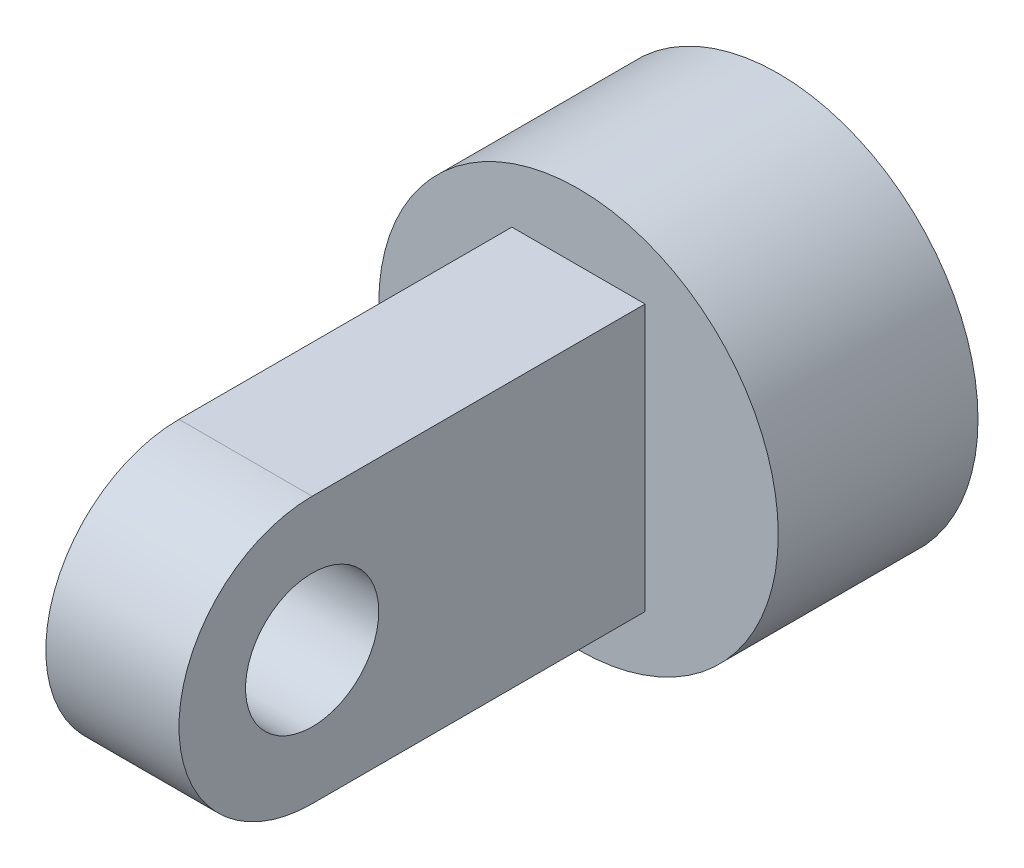
ISO-10303-21;
HEADER;
FILE_DESCRIPTION(('STEP AP214'),'2;1');
FILE_NAME('part.step','',(''),(''),'','','');
FILE_SCHEMA(('AUTOMOTIVE_DESIGN { 1 0 10303 214 1 1 1 1 }'));
ENDSEC;
DATA;
#1=APPLICATION_CONTEXT('core data for automotive mechanical design processes');
#2=APPLICATION_PROTOCOL_DEFINITION('international standard','automotive_design',2000,#1);
#3=PRODUCT_CONTEXT('',#1,'mechanical');
#4=PRODUCT('Part','Part','',(#3));
#5=PRODUCT_RELATED_PRODUCT_CATEGORY('part','',(#4));
#6=PRODUCT_DEFINITION_FORMATION('','',#4);
#7=PRODUCT_DEFINITION_CONTEXT('part definition',#1,'design');
#8=PRODUCT_DEFINITION('design','',#6,#7);
#9=PRODUCT_DEFINITION_SHAPE('','',#8);
#10=(LENGTH_UNIT() NAMED_UNIT(*) SI_UNIT(.MILLI.,.METRE.));
#11=(NAMED_UNIT(*) PLANE_ANGLE_UNIT() SI_UNIT($,.RADIAN.));
#12=(NAMED_UNIT(*) SI_UNIT($,.STERADIAN.) SOLID_ANGLE_UNIT());
#13=UNCERTAINTY_MEASURE_WITH_UNIT(LENGTH_MEASURE(1.E-05),#10,'distance_accuracy_value','');
#14=(GEOMETRIC_REPRESENTATION_CONTEXT(3) GLOBAL_UNCERTAINTY_ASSIGNED_CONTEXT((#13)) GLOBAL_UNIT_ASSIGNED_CONTEXT((#10,
#11,#12)) REPRESENTATION_CONTEXT('',''));
#15=CARTESIAN_POINT('',(0.,0.,0.));
#16=DIRECTION('',(0.,0.,1.));
#17=DIRECTION('',(1.,0.,0.));
#18=AXIS2_PLACEMENT_3D('',#15,#16,#17);
#19=CARTESIAN_POINT('',(12.7,0.,0.));
#20=DIRECTION('',(1.,0.,0.));
#21=DIRECTION('',(0.,0.,-1.));
#22=AXIS2_PLACEMENT_3D('',#19,#20,#21);
#23=PLANE('',#22);
#24=CARTESIAN_POINT('',(12.7,0.,0.));
#25=DIRECTION('',(1.,0.,0.));
#26=DIRECTION('',(0.,0.,-1.));
#27=AXIS2_PLACEMENT_3D('',#24,#25,#26);
#28=CIRCLE('',#27,12.7);
#29=CARTESIAN_POINT('',(12.7,12.7,0.));
#30=VERTEX_POINT('',#29);
#31=CARTESIAN_POINT('',(12.7,-12.7,0.));
#32=VERTEX_POINT('',#31);
#33=EDGE_CURVE('E12',#30,#32,#28,.T.);
#34=ORIENTED_EDGE('',*,*,#33,.T.);
#35=DIRECTION('',(0.,0.,-1.));
#36=VECTOR('',#35,1.);
#37=CARTESIAN_POINT('',(12.7,-12.7,-31.75));
#38=LINE('',#37,#36);
#39=CARTESIAN_POINT('',(12.7,-12.7,-31.75));
#40=VERTEX_POINT('',#39);
#41=EDGE_CURVE('E190',#32,#40,#38,.T.);
#42=ORIENTED_EDGE('',*,*,#41,.T.);
#43=DIRECTION('',(0.,1.,0.));
#44=VECTOR('',#43,1.);
#45=CARTESIAN_POINT('',(12.7,12.7,-31.75));
#46=LINE('',#45,#44);
#47=CARTESIAN_POINT('',(12.7,12.7,-31.75));
#48=VERTEX_POINT('',#47);
#49=EDGE_CURVE('E96',#40,#48,#46,.T.);
#50=ORIENTED_EDGE('',*,*,#49,.T.);
#51=DIRECTION('',(0.,0.,1.));
#52=VECTOR('',#51,1.);
#53=CARTESIAN_POINT('',(12.7,12.7,0.));
#54=LINE('',#53,#52);
#55=EDGE_CURVE('E191',#48,#30,#54,.T.);
#56=ORIENTED_EDGE('',*,*,#55,.T.);
#57=EDGE_LOOP('',(#34,#42,#50,#56));
#58=FACE_BOUND('',#57,.T.);
#59=CARTESIAN_POINT('',(12.7,0.,0.));
#60=DIRECTION('',(1.,0.,0.));
#61=DIRECTION('',(0.,0.,-1.));
#62=AXIS2_PLACEMENT_3D('',#59,#60,#61);
#63=CIRCLE('',#62,6.35);
#64=CARTESIAN_POINT('',(12.7,0.,-6.35));
#65=VERTEX_POINT('',#64);
#66=EDGE_CURVE('E125',#65,#65,#63,.T.);
#67=ORIENTED_EDGE('',*,*,#66,.F.);
#68=EDGE_LOOP('',(#67));
#69=FACE_BOUND('',#68,.T.);
#70=ADVANCED_FACE('F51',(#58,#69),#23,.T.);
#71=CARTESIAN_POINT('',(0.,0.,0.));
#72=DIRECTION('',(1.,0.,0.));
#73=DIRECTION('',(0.,0.,-1.));
#74=AXIS2_PLACEMENT_3D('',#71,#72,#73);
#75=PLANE('',#74);
#76=CARTESIAN_POINT('',(0.,0.,0.));
#77=DIRECTION('',(1.,0.,0.));
#78=DIRECTION('',(0.,0.,-1.));
#79=AXIS2_PLACEMENT_3D('',#76,#77,#78);
#80=CIRCLE('',#79,12.7);
#81=CARTESIAN_POINT('',(0.,12.7,0.));
#82=VERTEX_POINT('',#81);
#83=CARTESIAN_POINT('',(0.,-12.7,0.));
#84=VERTEX_POINT('',#83);
#85=EDGE_CURVE('E54',#82,#84,#80,.T.);
#86=ORIENTED_EDGE('',*,*,#85,.F.);
#87=DIRECTION('',(0.,0.,-1.));
#88=VECTOR('',#87,1.);
#89=CARTESIAN_POINT('',(0.,12.7,0.));
#90=LINE('',#89,#88);
#91=CARTESIAN_POINT('',(0.,12.7,-31.75));
#92=VERTEX_POINT('',#91);
#93=EDGE_CURVE('E112',#82,#92,#90,.T.);
#94=ORIENTED_EDGE('',*,*,#93,.T.);
#95=DIRECTION('',(0.,-1.,0.));
#96=VECTOR('',#95,1.);
#97=CARTESIAN_POINT('',(0.,12.7,-31.75));
#98=LINE('',#97,#96);
#99=CARTESIAN_POINT('',(0.,-12.7,-31.75));
#100=VERTEX_POINT('',#99);
#101=EDGE_CURVE('E91',#92,#100,#98,.T.);
#102=ORIENTED_EDGE('',*,*,#101,.T.);
#103=DIRECTION('',(0.,0.,1.));
#104=VECTOR('',#103,1.);
#105=CARTESIAN_POINT('',(0.,-12.7,-31.75));
#106=LINE('',#105,#104);
#107=EDGE_CURVE('E107',#100,#84,#106,.T.);
#108=ORIENTED_EDGE('',*,*,#107,.T.);
#109=EDGE_LOOP('',(#86,#94,#102,#108));
#110=FACE_BOUND('',#109,.T.);
#111=CARTESIAN_POINT('',(0.,0.,0.));
#112=DIRECTION('',(1.,0.,0.));
#113=DIRECTION('',(0.,0.,-1.));
#114=AXIS2_PLACEMENT_3D('',#111,#112,#113);
#115=CIRCLE('',#114,6.35);
#116=CARTESIAN_POINT('',(0.,0.,-6.35));
#117=VERTEX_POINT('',#116);
#118=EDGE_CURVE('E120',#117,#117,#115,.T.);
#119=ORIENTED_EDGE('',*,*,#118,.T.);
#120=EDGE_LOOP('',(#119));
#121=FACE_BOUND('',#120,.T.);
#122=ADVANCED_FACE('F106',(#110,#121),#75,.F.);
#123=CARTESIAN_POINT('',(12.7,0.,0.));
#124=DIRECTION('',(-1.,0.,0.));
#125=DIRECTION('',(0.,0.,1.));
#126=AXIS2_PLACEMENT_3D('',#123,#124,#125);
#127=CYLINDRICAL_SURFACE('',#126,12.7);
#128=ORIENTED_EDGE('',*,*,#85,.T.);
#129=DIRECTION('',(1.,0.,0.));
#130=VECTOR('',#129,1.);
#131=CARTESIAN_POINT('',(-40.6598389076986,-12.7,0.));
#132=LINE('',#131,#130);
#133=EDGE_CURVE('E103',#84,#32,#132,.T.);
#134=ORIENTED_EDGE('',*,*,#133,.T.);
#135=ORIENTED_EDGE('',*,*,#33,.F.);
#136=DIRECTION('',(1.,0.,0.));
#137=VECTOR('',#136,1.);
#138=CARTESIAN_POINT('',(-40.6598389076986,12.7,0.));
#139=LINE('',#138,#137);
#140=EDGE_CURVE('E72',#82,#30,#139,.T.);
#141=ORIENTED_EDGE('',*,*,#140,.F.);
#142=EDGE_LOOP('',(#128,#134,#135,#141));
#143=FACE_BOUND('',#142,.T.);
#144=ADVANCED_FACE('F52',(#143),#127,.T.);
#145=CARTESIAN_POINT('',(12.7,0.,0.));
#146=DIRECTION('',(-1.,0.,0.));
#147=DIRECTION('',(0.,0.,1.));
#148=AXIS2_PLACEMENT_3D('',#145,#146,#147);
#149=CYLINDRICAL_SURFACE('',#148,6.35);
#150=ORIENTED_EDGE('',*,*,#66,.T.);
#151=EDGE_LOOP('',(#150));
#152=FACE_BOUND('',#151,.T.);
#153=ORIENTED_EDGE('',*,*,#118,.F.);
#154=EDGE_LOOP('',(#153));
#155=FACE_BOUND('',#154,.T.);
#156=ADVANCED_FACE('F135',(#152,#155),#149,.F.);
#157=CARTESIAN_POINT('',(-40.6598389076986,12.7,0.));
#158=DIRECTION('',(0.,1.,0.));
#159=DIRECTION('',(0.,0.,1.));
#160=AXIS2_PLACEMENT_3D('',#157,#158,#159);
#161=PLANE('',#160);
#162=ORIENTED_EDGE('',*,*,#93,.F.);
#163=ORIENTED_EDGE('',*,*,#140,.T.);
#164=ORIENTED_EDGE('',*,*,#55,.F.);
#165=DIRECTION('',(1.,0.,0.));
#166=VECTOR('',#165,1.);
#167=CARTESIAN_POINT('',(-40.6598389076986,12.7,-31.75));
#168=LINE('',#167,#166);
#169=EDGE_CURVE('E105',#92,#48,#168,.T.);
#170=ORIENTED_EDGE('',*,*,#169,.F.);
#171=EDGE_LOOP('',(#162,#163,#164,#170));
#172=FACE_BOUND('',#171,.T.);
#173=ADVANCED_FACE('F144',(#172),#161,.T.);
#174=CARTESIAN_POINT('',(-40.6598389076986,-12.7,-31.75));
#175=DIRECTION('',(0.,-1.,0.));
#176=DIRECTION('',(0.,0.,-1.));
#177=AXIS2_PLACEMENT_3D('',#174,#175,#176);
#178=PLANE('',#177);
#179=ORIENTED_EDGE('',*,*,#107,.F.);
#180=DIRECTION('',(1.,0.,0.));
#181=VECTOR('',#180,1.);
#182=CARTESIAN_POINT('',(-40.6598389076986,-12.7,-31.75));
#183=LINE('',#182,#181);
#184=EDGE_CURVE('E90',#100,#40,#183,.T.);
#185=ORIENTED_EDGE('',*,*,#184,.T.);
#186=ORIENTED_EDGE('',*,*,#41,.F.);
#187=ORIENTED_EDGE('',*,*,#133,.F.);
#188=EDGE_LOOP('',(#179,#185,#186,#187));
#189=FACE_BOUND('',#188,.T.);
#190=ADVANCED_FACE('F113',(#189),#178,.T.);
#191=CARTESIAN_POINT('',(6.35,0.,-50.8));
#192=DIRECTION('',(0.,0.,1.));
#193=DIRECTION('',(1.,0.,0.));
#194=AXIS2_PLACEMENT_3D('',#191,#192,#193);
#195=CYLINDRICAL_SURFACE('',#194,19.05);
#196=CARTESIAN_POINT('',(6.35,0.,-50.8));
#197=DIRECTION('',(0.,0.,-1.));
#198=DIRECTION('',(-1.,0.,0.));
#199=AXIS2_PLACEMENT_3D('',#196,#197,#198);
#200=CIRCLE('',#199,19.05);
#201=CARTESIAN_POINT('',(25.4,0.,-50.8));
#202=VERTEX_POINT('',#201);
#203=EDGE_CURVE('E177',#202,#202,#200,.T.);
#204=CARTESIAN_POINT('',(6.35,0.,-31.75));
#205=DIRECTION('',(0.,0.,-1.));
#206=DIRECTION('',(-1.,0.,0.));
#207=AXIS2_PLACEMENT_3D('',#204,#205,#206);
#208=CIRCLE('',#207,19.05);
#209=CARTESIAN_POINT('',(25.4,0.,-31.75));
#210=VERTEX_POINT('',#209);
#211=EDGE_CURVE('E173',#210,#210,#208,.T.);
#212=CARTESIAN_POINT('',(25.4,0.,-50.8));
#213=CARTESIAN_POINT('',(25.4,0.,-50.6015625));
#214=CARTESIAN_POINT('',(25.4,0.,-50.403125));
#215=CARTESIAN_POINT('',(25.4,0.,-50.00625));
#216=CARTESIAN_POINT('',(25.4,0.,-49.8078125));
#217=CARTESIAN_POINT('',(25.4,0.,-49.4109375));
#218=CARTESIAN_POINT('',(25.4,0.,-49.2125));
#219=CARTESIAN_POINT('',(25.4,0.,-48.815625));
#220=CARTESIAN_POINT('',(25.4,0.,-48.6171875));
#221=CARTESIAN_POINT('',(25.4,0.,-48.2203125));
#222=CARTESIAN_POINT('',(25.4,0.,-48.021875));
#223=CARTESIAN_POINT('',(25.4,0.,-47.625));
#224=CARTESIAN_POINT('',(25.4,0.,-47.4265625));
#225=CARTESIAN_POINT('',(25.4,0.,-47.0296875));
#226=CARTESIAN_POINT('',(25.4,0.,-46.83125));
#227=CARTESIAN_POINT('',(25.4,0.,-46.434375));
#228=CARTESIAN_POINT('',(25.4,0.,-46.2359375));
#229=CARTESIAN_POINT('',(25.4,0.,-45.8390625));
#230=CARTESIAN_POINT('',(25.4,0.,-45.640625));
#231=CARTESIAN_POINT('',(25.4,0.,-45.24375));
#232=CARTESIAN_POINT('',(25.4,0.,-45.0453125));
#233=CARTESIAN_POINT('',(25.4,0.,-44.6484375));
#234=CARTESIAN_POINT('',(25.4,0.,-44.45));
#235=CARTESIAN_POINT('',(25.4,0.,-44.053125));
#236=CARTESIAN_POINT('',(25.4,0.,-43.8546875));
#237=CARTESIAN_POINT('',(25.4,0.,-43.4578125));
#238=CARTESIAN_POINT('',(25.4,0.,-43.259375));
#239=CARTESIAN_POINT('',(25.4,0.,-42.8625));
#240=CARTESIAN_POINT('',(25.4,0.,-42.6640625));
#241=CARTESIAN_POINT('',(25.4,0.,-42.2671875));
#242=CARTESIAN_POINT('',(25.4,0.,-42.06875));
#243=CARTESIAN_POINT('',(25.4,0.,-41.671875));
#244=CARTESIAN_POINT('',(25.4,0.,-41.4734375));
#245=CARTESIAN_POINT('',(25.4,0.,-41.0765625));
#246=CARTESIAN_POINT('',(25.4,0.,-40.878125));
#247=CARTESIAN_POINT('',(25.4,0.,-40.48125));
#248=CARTESIAN_POINT('',(25.4,0.,-40.2828125));
#249=CARTESIAN_POINT('',(25.4,0.,-39.8859375));
#250=CARTESIAN_POINT('',(25.4,0.,-39.6875));
#251=CARTESIAN_POINT('',(25.4,0.,-39.290625));
#252=CARTESIAN_POINT('',(25.4,0.,-39.0921875));
#253=CARTESIAN_POINT('',(25.4,0.,-38.6953125));
#254=CARTESIAN_POINT('',(25.4,0.,-38.496875));
#255=CARTESIAN_POINT('',(25.4,0.,-38.1));
#256=CARTESIAN_POINT('',(25.4,0.,-37.9015625));
#257=CARTESIAN_POINT('',(25.4,0.,-37.5046875));
#258=CARTESIAN_POINT('',(25.4,0.,-37.30625));
#259=CARTESIAN_POINT('',(25.4,0.,-36.909375));
#260=CARTESIAN_POINT('',(25.4,0.,-36.7109375));
#261=CARTESIAN_POINT('',(25.4,0.,-36.3140625));
#262=CARTESIAN_POINT('',(25.4,0.,-36.115625));
#263=CARTESIAN_POINT('',(25.4,0.,-35.71875));
#264=CARTESIAN_POINT('',(25.4,0.,-35.5203125));
#265=CARTESIAN_POINT('',(25.4,0.,-35.1234375));
#266=CARTESIAN_POINT('',(25.4,0.,-34.925));
#267=CARTESIAN_POINT('',(25.4,0.,-34.528125));
#268=CARTESIAN_POINT('',(25.4,0.,-34.3296875));
#269=CARTESIAN_POINT('',(25.4,0.,-33.9328125));
#270=CARTESIAN_POINT('',(25.4,0.,-33.734375));
#271=CARTESIAN_POINT('',(25.4,0.,-33.3375));
#272=CARTESIAN_POINT('',(25.4,0.,-33.1390625));
#273=CARTESIAN_POINT('',(25.4,0.,-32.7421875));
#274=CARTESIAN_POINT('',(25.4,0.,-32.54375));
#275=CARTESIAN_POINT('',(25.4,0.,-32.146875));
#276=CARTESIAN_POINT('',(25.4,0.,-31.9484375));
#277=CARTESIAN_POINT('',(25.4,0.,-31.75));
#278=B_SPLINE_CURVE_WITH_KNOTS('',3,(#212,#213,#214,#215,#216,#217,#218,#219,#220,#221,#222,
#223,#224,#225,#226,#227,#228,#229,#230,#231,#232,#233,#234,#235,#236,#237,#238,#239,#240,#241,
#242,#243,#244,#245,#246,#247,#248,#249,#250,#251,#252,#253,#254,#255,#256,#257,#258,#259,#260,
#261,#262,#263,#264,#265,#266,#267,#268,#269,#270,#271,#272,#273,#274,#275,#276,#277),
.UNSPECIFIED.,.F.,.F.,(4,2,2,2,2,2,2,2,2,2,2,2,2,2,2,2,2,2,2,2,2,2,2,2,2,2,2,2,2,2,2,2,4),(0.,
0.595312499999993,1.19062499999999,1.78593749999999,2.38124999999999,2.97656249999999,3.571875,
4.1671875,4.7625,5.3578125,5.953125,6.5484375,7.14375,7.7390625,8.334375,8.9296875,9.525,
10.1203125,10.715625,11.3109375,11.90625,12.5015625,13.096875,13.6921875,14.2875,14.8828125,
15.478125,16.0734375,16.66875,17.2640625,17.859375,18.4546875,19.05),.UNSPECIFIED.);
#279=EDGE_CURVE('BSEAM146',#202,#210,#278,.T.);
#280=ORIENTED_EDGE('',*,*,#203,.F.);
#281=ORIENTED_EDGE('',*,*,#211,.T.);
#282=ORIENTED_EDGE('',*,*,#279,.T.);
#283=ORIENTED_EDGE('',*,*,#279,.F.);
#284=EDGE_LOOP('',(#280,#282,#281,#283));
#285=FACE_BOUND('',#284,.T.);
#286=ADVANCED_FACE('F146',(#285),#195,.T.);
#287=CARTESIAN_POINT('',(6.35,0.,-50.8));
#288=DIRECTION('',(0.,0.,-1.));
#289=DIRECTION('',(-1.,0.,0.));
#290=AXIS2_PLACEMENT_3D('',#287,#288,#289);
#291=PLANE('',#290);
#292=CARTESIAN_POINT('',(6.35,0.,-50.8));
#293=DIRECTION('',(0.,0.,-1.));
#294=DIRECTION('',(-1.,0.,0.));
#295=AXIS2_PLACEMENT_3D('',#292,#293,#294);
#296=CIRCLE('',#295,12.7);
#297=CARTESIAN_POINT('',(-6.35,0.,-50.8));
#298=VERTEX_POINT('',#297);
#299=EDGE_CURVE('E174',#298,#298,#296,.T.);
#300=ORIENTED_EDGE('',*,*,#299,.F.);
#301=EDGE_LOOP('',(#300));
#302=FACE_BOUND('',#301,.T.);
#303=ORIENTED_EDGE('',*,*,#203,.T.);
#304=EDGE_LOOP('',(#303));
#305=FACE_BOUND('',#304,.T.);
#306=ADVANCED_FACE('F152',(#302,#305),#291,.T.);
#307=CARTESIAN_POINT('',(6.35,0.,-31.75));
#308=DIRECTION('',(0.,0.,-1.));
#309=DIRECTION('',(-1.,0.,0.));
#310=AXIS2_PLACEMENT_3D('',#307,#308,#309);
#311=PLANE('',#310);
#312=ORIENTED_EDGE('',*,*,#101,.F.);
#313=ORIENTED_EDGE('',*,*,#169,.T.);
#314=ORIENTED_EDGE('',*,*,#49,.F.);
#315=ORIENTED_EDGE('',*,*,#184,.F.);
#316=EDGE_LOOP('',(#312,#313,#314,#315));
#317=FACE_BOUND('',#316,.T.);
#318=ORIENTED_EDGE('',*,*,#211,.F.);
#319=EDGE_LOOP('',(#318));
#320=FACE_BOUND('',#319,.T.);
#321=ADVANCED_FACE('F93',(#317,#320),#311,.F.);
#322=CARTESIAN_POINT('',(6.35,0.,-44.45));
#323=DIRECTION('',(0.,0.,-1.));
#324=DIRECTION('',(-1.,0.,0.));
#325=AXIS2_PLACEMENT_3D('',#322,#323,#324);
#326=CYLINDRICAL_SURFACE('',#325,12.7);
#327=CARTESIAN_POINT('',(6.35,0.,-44.45));
#328=DIRECTION('',(0.,0.,-1.));
#329=DIRECTION('',(-1.,0.,0.));
#330=AXIS2_PLACEMENT_3D('',#327,#328,#329);
#331=CIRCLE('',#330,12.7);
#332=CARTESIAN_POINT('',(-6.35,0.,-44.45));
#333=VERTEX_POINT('',#332);
#334=EDGE_CURVE('E175',#333,#333,#331,.T.);
#335=ORIENTED_EDGE('',*,*,#334,.F.);
#336=EDGE_LOOP('',(#335));
#337=FACE_BOUND('',#336,.T.);
#338=ORIENTED_EDGE('',*,*,#299,.T.);
#339=EDGE_LOOP('',(#338));
#340=FACE_BOUND('',#339,.T.);
#341=ADVANCED_FACE('F158',(#337,#340),#326,.F.);
#342=CARTESIAN_POINT('',(6.35,0.,-44.45));
#343=DIRECTION('',(0.,0.,-1.));
#344=DIRECTION('',(-1.,0.,0.));
#345=AXIS2_PLACEMENT_3D('',#342,#343,#344);
#346=PLANE('',#345);
#347=ORIENTED_EDGE('',*,*,#334,.T.);
#348=EDGE_LOOP('',(#347));
#349=FACE_BOUND('',#348,.T.);
#350=ADVANCED_FACE('F163',(#349),#346,.T.);
#351=CLOSED_SHELL('',(#70,#122,#144,#156,#173,#190,#286,#306,#321,#341,#350));
#352=MANIFOLD_SOLID_BREP('B2',#351);
#353=ADVANCED_BREP_SHAPE_REPRESENTATION('',(#18,#352),#14);
#354=SHAPE_DEFINITION_REPRESENTATION(#9,#353);
ENDSEC;
END-ISO-10303-21;
